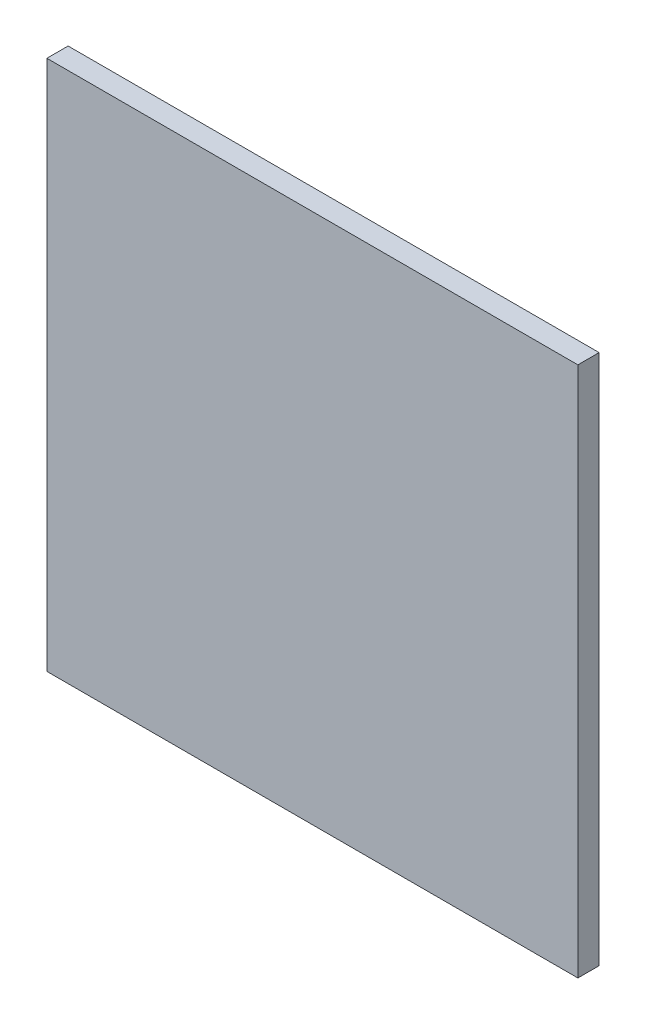
ISO-10303-21;
HEADER;
FILE_DESCRIPTION(('STEP AP214'),'2;1');
FILE_NAME('part.step','',(''),(''),'','','');
FILE_SCHEMA(('AUTOMOTIVE_DESIGN { 1 0 10303 214 1 1 1 1 }'));
ENDSEC;
DATA;
#1=APPLICATION_CONTEXT('core data for automotive mechanical design processes');
#2=APPLICATION_PROTOCOL_DEFINITION('international standard','automotive_design',2000,#1);
#3=PRODUCT_CONTEXT('',#1,'mechanical');
#4=PRODUCT('Part','Part','',(#3));
#5=PRODUCT_RELATED_PRODUCT_CATEGORY('part','',(#4));
#6=PRODUCT_DEFINITION_FORMATION('','',#4);
#7=PRODUCT_DEFINITION_CONTEXT('part definition',#1,'design');
#8=PRODUCT_DEFINITION('design','',#6,#7);
#9=PRODUCT_DEFINITION_SHAPE('','',#8);
#10=(LENGTH_UNIT() NAMED_UNIT(*) SI_UNIT(.MILLI.,.METRE.));
#11=(NAMED_UNIT(*) PLANE_ANGLE_UNIT() SI_UNIT($,.RADIAN.));
#12=(NAMED_UNIT(*) SI_UNIT($,.STERADIAN.) SOLID_ANGLE_UNIT());
#13=UNCERTAINTY_MEASURE_WITH_UNIT(LENGTH_MEASURE(1.E-05),#10,'distance_accuracy_value','');
#14=(GEOMETRIC_REPRESENTATION_CONTEXT(3) GLOBAL_UNCERTAINTY_ASSIGNED_CONTEXT((#13)) GLOBAL_UNIT_ASSIGNED_CONTEXT((#10,
#11,#12)) REPRESENTATION_CONTEXT('',''));
#15=CARTESIAN_POINT('',(0.,0.,0.));
#16=DIRECTION('',(0.,0.,1.));
#17=DIRECTION('',(1.,0.,0.));
#18=AXIS2_PLACEMENT_3D('',#15,#16,#17);
#19=CARTESIAN_POINT('',(15.,-15.,1.2));
#20=DIRECTION('',(-1.,0.,0.));
#21=DIRECTION('',(0.,0.,1.));
#22=AXIS2_PLACEMENT_3D('',#19,#20,#21);
#23=PLANE('',#22);
#24=DIRECTION('',(0.,1.,0.));
#25=VECTOR('',#24,1.);
#26=CARTESIAN_POINT('',(15.,-15.,0.));
#27=LINE('',#26,#25);
#28=CARTESIAN_POINT('',(15.,-15.,0.));
#29=VERTEX_POINT('',#28);
#30=CARTESIAN_POINT('',(15.,15.,0.));
#31=VERTEX_POINT('',#30);
#32=EDGE_CURVE('E100',#29,#31,#27,.T.);
#33=ORIENTED_EDGE('',*,*,#32,.T.);
#34=DIRECTION('',(0.,0.,-1.));
#35=VECTOR('',#34,1.);
#36=CARTESIAN_POINT('',(15.,15.,1.2));
#37=LINE('',#36,#35);
#38=CARTESIAN_POINT('',(15.,15.,1.2));
#39=VERTEX_POINT('',#38);
#40=EDGE_CURVE('E11',#39,#31,#37,.T.);
#41=ORIENTED_EDGE('',*,*,#40,.F.);
#42=DIRECTION('',(0.,1.,0.));
#43=VECTOR('',#42,1.);
#44=CARTESIAN_POINT('',(15.,-15.,1.2));
#45=LINE('',#44,#43);
#46=CARTESIAN_POINT('',(15.,-15.,1.2));
#47=VERTEX_POINT('',#46);
#48=EDGE_CURVE('E88',#47,#39,#45,.T.);
#49=ORIENTED_EDGE('',*,*,#48,.F.);
#50=DIRECTION('',(0.,0.,-1.));
#51=VECTOR('',#50,1.);
#52=CARTESIAN_POINT('',(15.,-15.,1.2));
#53=LINE('',#52,#51);
#54=EDGE_CURVE('E96',#47,#29,#53,.T.);
#55=ORIENTED_EDGE('',*,*,#54,.T.);
#56=EDGE_LOOP('',(#33,#41,#49,#55));
#57=FACE_BOUND('',#56,.T.);
#58=ADVANCED_FACE('F37',(#57),#23,.F.);
#59=CARTESIAN_POINT('',(-15.,15.,1.2));
#60=DIRECTION('',(0.,-1.,0.));
#61=DIRECTION('',(0.,0.,-1.));
#62=AXIS2_PLACEMENT_3D('',#59,#60,#61);
#63=PLANE('',#62);
#64=DIRECTION('',(-1.,0.,0.));
#65=VECTOR('',#64,1.);
#66=CARTESIAN_POINT('',(-15.,15.,0.));
#67=LINE('',#66,#65);
#68=CARTESIAN_POINT('',(-15.,15.,0.));
#69=VERTEX_POINT('',#68);
#70=EDGE_CURVE('E92',#31,#69,#67,.T.);
#71=ORIENTED_EDGE('',*,*,#70,.T.);
#72=DIRECTION('',(0.,0.,-1.));
#73=VECTOR('',#72,1.);
#74=CARTESIAN_POINT('',(-15.,15.,1.2));
#75=LINE('',#74,#73);
#76=CARTESIAN_POINT('',(-15.,15.,1.2));
#77=VERTEX_POINT('',#76);
#78=EDGE_CURVE('E45',#77,#69,#75,.T.);
#79=ORIENTED_EDGE('',*,*,#78,.F.);
#80=DIRECTION('',(-1.,0.,0.));
#81=VECTOR('',#80,1.);
#82=CARTESIAN_POINT('',(-15.,15.,1.2));
#83=LINE('',#82,#81);
#84=EDGE_CURVE('E83',#39,#77,#83,.T.);
#85=ORIENTED_EDGE('',*,*,#84,.F.);
#86=ORIENTED_EDGE('',*,*,#40,.T.);
#87=EDGE_LOOP('',(#71,#79,#85,#86));
#88=FACE_BOUND('',#87,.T.);
#89=ADVANCED_FACE('F91',(#88),#63,.F.);
#90=CARTESIAN_POINT('',(-15.,-15.,1.2));
#91=DIRECTION('',(1.,0.,0.));
#92=DIRECTION('',(0.,0.,-1.));
#93=AXIS2_PLACEMENT_3D('',#90,#91,#92);
#94=PLANE('',#93);
#95=DIRECTION('',(0.,-1.,0.));
#96=VECTOR('',#95,1.);
#97=CARTESIAN_POINT('',(-15.,-15.,0.));
#98=LINE('',#97,#96);
#99=CARTESIAN_POINT('',(-15.,-15.,0.));
#100=VERTEX_POINT('',#99);
#101=EDGE_CURVE('E70',#69,#100,#98,.T.);
#102=ORIENTED_EDGE('',*,*,#101,.T.);
#103=DIRECTION('',(0.,0.,-1.));
#104=VECTOR('',#103,1.);
#105=CARTESIAN_POINT('',(-15.,-15.,1.2));
#106=LINE('',#105,#104);
#107=CARTESIAN_POINT('',(-15.,-15.,1.2));
#108=VERTEX_POINT('',#107);
#109=EDGE_CURVE('E93',#108,#100,#106,.T.);
#110=ORIENTED_EDGE('',*,*,#109,.F.);
#111=DIRECTION('',(0.,-1.,0.));
#112=VECTOR('',#111,1.);
#113=CARTESIAN_POINT('',(-15.,-15.,1.2));
#114=LINE('',#113,#112);
#115=EDGE_CURVE('E86',#77,#108,#114,.T.);
#116=ORIENTED_EDGE('',*,*,#115,.F.);
#117=ORIENTED_EDGE('',*,*,#78,.T.);
#118=EDGE_LOOP('',(#102,#110,#116,#117));
#119=FACE_BOUND('',#118,.T.);
#120=ADVANCED_FACE('F94',(#119),#94,.F.);
#121=CARTESIAN_POINT('',(-15.,-15.,1.2));
#122=DIRECTION('',(0.,1.,0.));
#123=DIRECTION('',(0.,0.,1.));
#124=AXIS2_PLACEMENT_3D('',#121,#122,#123);
#125=PLANE('',#124);
#126=DIRECTION('',(1.,0.,0.));
#127=VECTOR('',#126,1.);
#128=CARTESIAN_POINT('',(-15.,-15.,0.));
#129=LINE('',#128,#127);
#130=EDGE_CURVE('E76',#100,#29,#129,.T.);
#131=ORIENTED_EDGE('',*,*,#130,.T.);
#132=ORIENTED_EDGE('',*,*,#54,.F.);
#133=DIRECTION('',(1.,0.,0.));
#134=VECTOR('',#133,1.);
#135=CARTESIAN_POINT('',(-15.,-15.,1.2));
#136=LINE('',#135,#134);
#137=EDGE_CURVE('E53',#108,#47,#136,.T.);
#138=ORIENTED_EDGE('',*,*,#137,.F.);
#139=ORIENTED_EDGE('',*,*,#109,.T.);
#140=EDGE_LOOP('',(#131,#132,#138,#139));
#141=FACE_BOUND('',#140,.T.);
#142=ADVANCED_FACE('F107',(#141),#125,.F.);
#143=CARTESIAN_POINT('',(0.,0.,1.2));
#144=DIRECTION('',(0.,0.,-1.));
#145=DIRECTION('',(-1.,0.,0.));
#146=AXIS2_PLACEMENT_3D('',#143,#144,#145);
#147=PLANE('',#146);
#148=ORIENTED_EDGE('',*,*,#48,.T.);
#149=ORIENTED_EDGE('',*,*,#84,.T.);
#150=ORIENTED_EDGE('',*,*,#115,.T.);
#151=ORIENTED_EDGE('',*,*,#137,.T.);
#152=EDGE_LOOP('',(#148,#149,#150,#151));
#153=FACE_BOUND('',#152,.T.);
#154=ADVANCED_FACE('F84',(#153),#147,.F.);
#155=CARTESIAN_POINT('',(0.,0.,0.));
#156=DIRECTION('',(0.,0.,-1.));
#157=DIRECTION('',(-1.,0.,0.));
#158=AXIS2_PLACEMENT_3D('',#155,#156,#157);
#159=PLANE('',#158);
#160=ORIENTED_EDGE('',*,*,#32,.F.);
#161=ORIENTED_EDGE('',*,*,#130,.F.);
#162=ORIENTED_EDGE('',*,*,#101,.F.);
#163=ORIENTED_EDGE('',*,*,#70,.F.);
#164=EDGE_LOOP('',(#160,#161,#162,#163));
#165=FACE_BOUND('',#164,.T.);
#166=ADVANCED_FACE('F110',(#165),#159,.T.);
#167=CLOSED_SHELL('',(#58,#89,#120,#142,#154,#166));
#168=MANIFOLD_SOLID_BREP('B2',#167);
#169=ADVANCED_BREP_SHAPE_REPRESENTATION('',(#18,#168),#14);
#170=SHAPE_DEFINITION_REPRESENTATION(#9,#169);
ENDSEC;
END-ISO-10303-21;
